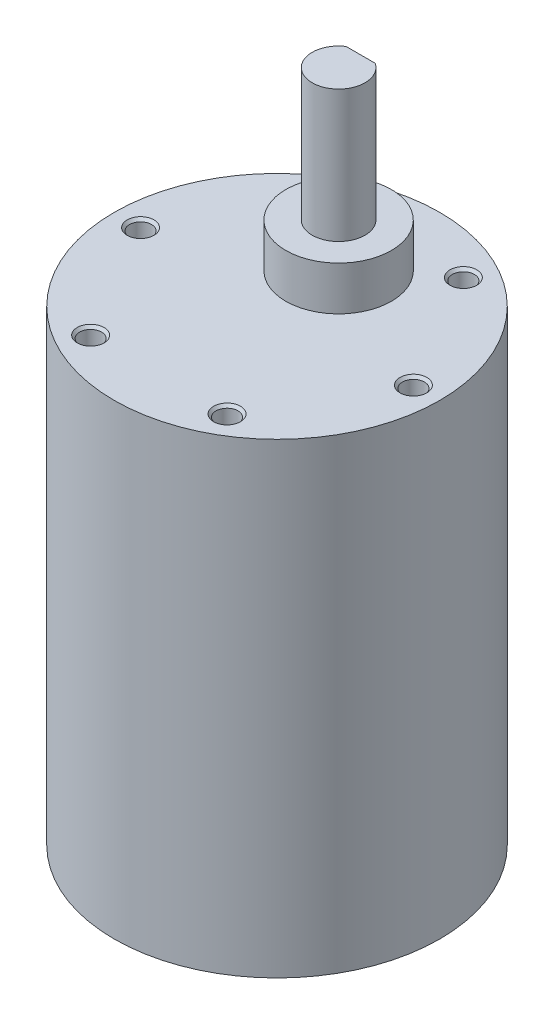
ISO-10303-21;
HEADER;
FILE_DESCRIPTION(('STEP AP214'),'2;1');
FILE_NAME('part.step','',(''),(''),'','','');
FILE_SCHEMA(('AUTOMOTIVE_DESIGN { 1 0 10303 214 1 1 1 1 }'));
ENDSEC;
DATA;
#1=APPLICATION_CONTEXT('core data for automotive mechanical design processes');
#2=APPLICATION_PROTOCOL_DEFINITION('international standard','automotive_design',2000,#1);
#3=PRODUCT_CONTEXT('',#1,'mechanical');
#4=PRODUCT('Part','Part','',(#3));
#5=PRODUCT_RELATED_PRODUCT_CATEGORY('part','',(#4));
#6=PRODUCT_DEFINITION_FORMATION('','',#4);
#7=PRODUCT_DEFINITION_CONTEXT('part definition',#1,'design');
#8=PRODUCT_DEFINITION('design','',#6,#7);
#9=PRODUCT_DEFINITION_SHAPE('','',#8);
#10=(LENGTH_UNIT() NAMED_UNIT(*) SI_UNIT(.MILLI.,.METRE.));
#11=(NAMED_UNIT(*) PLANE_ANGLE_UNIT() SI_UNIT($,.RADIAN.));
#12=(NAMED_UNIT(*) SI_UNIT($,.STERADIAN.) SOLID_ANGLE_UNIT());
#13=UNCERTAINTY_MEASURE_WITH_UNIT(LENGTH_MEASURE(1.E-05),#10,'distance_accuracy_value','');
#14=(GEOMETRIC_REPRESENTATION_CONTEXT(3) GLOBAL_UNCERTAINTY_ASSIGNED_CONTEXT((#13)) GLOBAL_UNIT_ASSIGNED_CONTEXT((#10,
#11,#12)) REPRESENTATION_CONTEXT('',''));
#15=CARTESIAN_POINT('',(0.,0.,0.));
#16=DIRECTION('',(0.,0.,1.));
#17=DIRECTION('',(1.,0.,0.));
#18=AXIS2_PLACEMENT_3D('',#15,#16,#17);
#19=CARTESIAN_POINT('',(0.,53.,0.));
#20=DIRECTION('',(0.,-1.,0.));
#21=DIRECTION('',(0.,0.,-1.));
#22=AXIS2_PLACEMENT_3D('',#19,#20,#21);
#23=CYLINDRICAL_SURFACE('',#22,18.5);
#24=CARTESIAN_POINT('',(0.,53.,0.));
#25=DIRECTION('',(0.,1.,0.));
#26=DIRECTION('',(0.,0.,1.));
#27=AXIS2_PLACEMENT_3D('',#24,#25,#26);
#28=CIRCLE('',#27,18.5);
#29=CARTESIAN_POINT('',(0.,53.,18.5));
#30=VERTEX_POINT('',#29);
#31=EDGE_CURVE('E201',#30,#30,#28,.T.);
#32=ORIENTED_EDGE('',*,*,#31,.F.);
#33=EDGE_LOOP('',(#32));
#34=FACE_BOUND('',#33,.T.);
#35=CARTESIAN_POINT('',(0.,0.,0.));
#36=DIRECTION('',(0.,1.,0.));
#37=DIRECTION('',(0.,0.,1.));
#38=AXIS2_PLACEMENT_3D('',#35,#36,#37);
#39=CIRCLE('',#38,18.5);
#40=CARTESIAN_POINT('',(0.,0.,18.5));
#41=VERTEX_POINT('',#40);
#42=EDGE_CURVE('E196',#41,#41,#39,.T.);
#43=ORIENTED_EDGE('',*,*,#42,.T.);
#44=EDGE_LOOP('',(#43));
#45=FACE_BOUND('',#44,.T.);
#46=ADVANCED_FACE('F54',(#34,#45),#23,.T.);
#47=CARTESIAN_POINT('',(0.,53.,0.));
#48=DIRECTION('',(0.,1.,0.));
#49=DIRECTION('',(0.,0.,1.));
#50=AXIS2_PLACEMENT_3D('',#47,#48,#49);
#51=PLANE('',#50);
#52=CARTESIAN_POINT('',(15.5,53.,-1.62196645003831E-13));
#53=DIRECTION('',(0.,1.,0.));
#54=DIRECTION('',(0.,0.,1.));
#55=AXIS2_PLACEMENT_3D('',#52,#53,#54);
#56=CIRCLE('',#55,1.525);
#57=CARTESIAN_POINT('',(15.5,53.,1.52499999999984));
#58=VERTEX_POINT('',#57);
#59=EDGE_CURVE('E118',#58,#58,#56,.T.);
#60=ORIENTED_EDGE('',*,*,#59,.F.);
#61=EDGE_LOOP('',(#60));
#62=FACE_BOUND('',#61,.T.);
#63=CARTESIAN_POINT('',(7.75000000000011,53.,13.4233937586587));
#64=DIRECTION('',(0.,1.,0.));
#65=DIRECTION('',(0.,0.,1.));
#66=AXIS2_PLACEMENT_3D('',#63,#64,#65);
#67=CIRCLE('',#66,1.525);
#68=CARTESIAN_POINT('',(7.75000000000011,53.,14.9483937586587));
#69=VERTEX_POINT('',#68);
#70=EDGE_CURVE('E109',#69,#69,#67,.T.);
#71=ORIENTED_EDGE('',*,*,#70,.F.);
#72=EDGE_LOOP('',(#71));
#73=FACE_BOUND('',#72,.T.);
#74=CARTESIAN_POINT('',(-7.75000000000002,53.,13.4233937586588));
#75=DIRECTION('',(0.,1.,0.));
#76=DIRECTION('',(0.,0.,1.));
#77=AXIS2_PLACEMENT_3D('',#74,#75,#76);
#78=CIRCLE('',#77,1.525);
#79=CARTESIAN_POINT('',(-7.75000000000002,53.,14.9483937586588));
#80=VERTEX_POINT('',#79);
#81=EDGE_CURVE('E129',#80,#80,#78,.T.);
#82=ORIENTED_EDGE('',*,*,#81,.F.);
#83=EDGE_LOOP('',(#82));
#84=FACE_BOUND('',#83,.T.);
#85=CARTESIAN_POINT('',(-15.5,53.,0.));
#86=DIRECTION('',(0.,1.,0.));
#87=DIRECTION('',(0.,0.,1.));
#88=AXIS2_PLACEMENT_3D('',#85,#86,#87);
#89=CIRCLE('',#88,1.525);
#90=CARTESIAN_POINT('',(-15.5,53.,1.52500000000005));
#91=VERTEX_POINT('',#90);
#92=EDGE_CURVE('E141',#91,#91,#89,.T.);
#93=ORIENTED_EDGE('',*,*,#92,.F.);
#94=EDGE_LOOP('',(#93));
#95=FACE_BOUND('',#94,.T.);
#96=CARTESIAN_POINT('',(-7.75000000000002,53.,-13.4233937586588));
#97=DIRECTION('',(0.,1.,0.));
#98=DIRECTION('',(0.,0.,1.));
#99=AXIS2_PLACEMENT_3D('',#96,#97,#98);
#100=CIRCLE('',#99,1.525);
#101=CARTESIAN_POINT('',(-7.75000000000002,53.,-11.8983937586588));
#102=VERTEX_POINT('',#101);
#103=EDGE_CURVE('E153',#102,#102,#100,.T.);
#104=ORIENTED_EDGE('',*,*,#103,.F.);
#105=EDGE_LOOP('',(#104));
#106=FACE_BOUND('',#105,.T.);
#107=CARTESIAN_POINT('',(7.75000000000002,53.,-13.4233937586588));
#108=DIRECTION('',(0.,1.,0.));
#109=DIRECTION('',(0.,0.,1.));
#110=AXIS2_PLACEMENT_3D('',#107,#108,#109);
#111=CIRCLE('',#110,1.525);
#112=CARTESIAN_POINT('',(7.75000000000002,53.,-11.8983937586588));
#113=VERTEX_POINT('',#112);
#114=EDGE_CURVE('E165',#113,#113,#111,.T.);
#115=ORIENTED_EDGE('',*,*,#114,.F.);
#116=EDGE_LOOP('',(#115));
#117=FACE_BOUND('',#116,.T.);
#118=CARTESIAN_POINT('',(0.,53.,-7.));
#119=DIRECTION('',(0.,1.,0.));
#120=DIRECTION('',(0.,0.,1.));
#121=AXIS2_PLACEMENT_3D('',#118,#119,#120);
#122=CIRCLE('',#121,6.);
#123=CARTESIAN_POINT('',(0.,53.,-0.999999999999999));
#124=VERTEX_POINT('',#123);
#125=EDGE_CURVE('E197',#124,#124,#122,.T.);
#126=ORIENTED_EDGE('',*,*,#125,.F.);
#127=EDGE_LOOP('',(#126));
#128=FACE_BOUND('',#127,.T.);
#129=ORIENTED_EDGE('',*,*,#31,.T.);
#130=EDGE_LOOP('',(#129));
#131=FACE_BOUND('',#130,.T.);
#132=ADVANCED_FACE('F229',(#62,#73,#84,#95,#106,#117,#128,#131),#51,.T.);
#133=CARTESIAN_POINT('',(0.,0.,0.));
#134=DIRECTION('',(0.,1.,0.));
#135=DIRECTION('',(0.,0.,1.));
#136=AXIS2_PLACEMENT_3D('',#133,#134,#135);
#137=PLANE('',#136);
#138=ORIENTED_EDGE('',*,*,#42,.F.);
#139=EDGE_LOOP('',(#138));
#140=FACE_BOUND('',#139,.T.);
#141=ADVANCED_FACE('F234',(#140),#137,.F.);
#142=CARTESIAN_POINT('',(0.,58.,-7.));
#143=DIRECTION('',(0.,-1.,0.));
#144=DIRECTION('',(0.,0.,-1.));
#145=AXIS2_PLACEMENT_3D('',#142,#143,#144);
#146=CYLINDRICAL_SURFACE('',#145,6.);
#147=CARTESIAN_POINT('',(0.,58.,-7.));
#148=DIRECTION('',(0.,1.,0.));
#149=DIRECTION('',(0.,0.,1.));
#150=AXIS2_PLACEMENT_3D('',#147,#148,#149);
#151=CIRCLE('',#150,6.);
#152=CARTESIAN_POINT('',(0.,58.,-0.999999999999999));
#153=VERTEX_POINT('',#152);
#154=EDGE_CURVE('E192',#153,#153,#151,.T.);
#155=ORIENTED_EDGE('',*,*,#154,.F.);
#156=EDGE_LOOP('',(#155));
#157=FACE_BOUND('',#156,.T.);
#158=ORIENTED_EDGE('',*,*,#125,.T.);
#159=EDGE_LOOP('',(#158));
#160=FACE_BOUND('',#159,.T.);
#161=ADVANCED_FACE('F242',(#157,#160),#146,.T.);
#162=CARTESIAN_POINT('',(0.,58.,0.));
#163=DIRECTION('',(0.,1.,0.));
#164=DIRECTION('',(0.,0.,1.));
#165=AXIS2_PLACEMENT_3D('',#162,#163,#164);
#166=PLANE('',#165);
#167=CARTESIAN_POINT('',(0.,58.,-7.));
#168=DIRECTION('',(0.,1.,0.));
#169=DIRECTION('',(0.,0.,1.));
#170=AXIS2_PLACEMENT_3D('',#167,#168,#169);
#171=CIRCLE('',#170,3.);
#172=CARTESIAN_POINT('',(0.,58.,-4.));
#173=VERTEX_POINT('',#172);
#174=EDGE_CURVE('E188',#173,#173,#171,.T.);
#175=ORIENTED_EDGE('',*,*,#174,.F.);
#176=EDGE_LOOP('',(#175));
#177=FACE_BOUND('',#176,.T.);
#178=ORIENTED_EDGE('',*,*,#154,.T.);
#179=EDGE_LOOP('',(#178));
#180=FACE_BOUND('',#179,.T.);
#181=ADVANCED_FACE('F225',(#177,#180),#166,.T.);
#182=CARTESIAN_POINT('',(0.,73.,-7.));
#183=DIRECTION('',(0.,-1.,0.));
#184=DIRECTION('',(0.,0.,-1.));
#185=AXIS2_PLACEMENT_3D('',#182,#183,#184);
#186=CYLINDRICAL_SURFACE('',#185,3.);
#187=CARTESIAN_POINT('',(0.,73.,-7.));
#188=DIRECTION('',(0.,1.,0.));
#189=DIRECTION('',(0.,0.,1.));
#190=AXIS2_PLACEMENT_3D('',#187,#188,#189);
#191=CIRCLE('',#190,3.);
#192=CARTESIAN_POINT('',(-1.6583123951777,73.,-9.5));
#193=VERTEX_POINT('',#192);
#194=CARTESIAN_POINT('',(1.6583123951777,73.,-9.5));
#195=VERTEX_POINT('',#194);
#196=EDGE_CURVE('E184',#193,#195,#191,.T.);
#197=ORIENTED_EDGE('',*,*,#196,.F.);
#198=DIRECTION('',(0.,-1.,0.));
#199=VECTOR('',#198,1.);
#200=CARTESIAN_POINT('',(-1.6583123951777,73.,-9.5));
#201=LINE('',#200,#199);
#202=CARTESIAN_POINT('',(-1.6583123951777,59.,-9.5));
#203=VERTEX_POINT('',#202);
#204=EDGE_CURVE('E69',#193,#203,#201,.T.);
#205=ORIENTED_EDGE('',*,*,#204,.T.);
#206=CARTESIAN_POINT('',(0.,59.,-7.));
#207=DIRECTION('',(0.,1.,0.));
#208=DIRECTION('',(0.,0.,1.));
#209=AXIS2_PLACEMENT_3D('',#206,#207,#208);
#210=CIRCLE('',#209,3.);
#211=CARTESIAN_POINT('',(1.6583123951777,59.,-9.5));
#212=VERTEX_POINT('',#211);
#213=EDGE_CURVE('E11',#212,#203,#210,.T.);
#214=ORIENTED_EDGE('',*,*,#213,.F.);
#215=DIRECTION('',(0.,-1.,0.));
#216=VECTOR('',#215,1.);
#217=CARTESIAN_POINT('',(1.6583123951777,73.,-9.5));
#218=LINE('',#217,#216);
#219=EDGE_CURVE('E74',#212,#195,#218,.F.);
#220=ORIENTED_EDGE('',*,*,#219,.T.);
#221=EDGE_LOOP('',(#197,#205,#214,#220));
#222=FACE_BOUND('',#221,.T.);
#223=ORIENTED_EDGE('',*,*,#174,.T.);
#224=EDGE_LOOP('',(#223));
#225=FACE_BOUND('',#224,.T.);
#226=ADVANCED_FACE('F213',(#222,#225),#186,.T.);
#227=CARTESIAN_POINT('',(0.,73.,0.));
#228=DIRECTION('',(0.,1.,0.));
#229=DIRECTION('',(0.,0.,1.));
#230=AXIS2_PLACEMENT_3D('',#227,#228,#229);
#231=PLANE('',#230);
#232=DIRECTION('',(1.,0.,0.));
#233=VECTOR('',#232,1.);
#234=CARTESIAN_POINT('',(0.,73.,-9.5));
#235=LINE('',#234,#233);
#236=EDGE_CURVE('E62',#193,#195,#235,.T.);
#237=ORIENTED_EDGE('',*,*,#236,.F.);
#238=ORIENTED_EDGE('',*,*,#196,.T.);
#239=EDGE_LOOP('',(#237,#238));
#240=FACE_BOUND('',#239,.T.);
#241=ADVANCED_FACE('F215',(#240),#231,.T.);
#242=CARTESIAN_POINT('',(0.,59.,0.));
#243=DIRECTION('',(0.,1.,0.));
#244=DIRECTION('',(0.,0.,1.));
#245=AXIS2_PLACEMENT_3D('',#242,#243,#244);
#246=PLANE('',#245);
#247=ORIENTED_EDGE('',*,*,#213,.T.);
#248=DIRECTION('',(1.,0.,0.));
#249=VECTOR('',#248,1.);
#250=CARTESIAN_POINT('',(-3.79972873056625,59.,-9.5));
#251=LINE('',#250,#249);
#252=EDGE_CURVE('E177',#203,#212,#251,.T.);
#253=ORIENTED_EDGE('',*,*,#252,.T.);
#254=EDGE_LOOP('',(#247,#253));
#255=FACE_BOUND('',#254,.T.);
#256=ADVANCED_FACE('F217',(#255),#246,.T.);
#257=CARTESIAN_POINT('',(-3.79972873056625,59.,-9.5));
#258=DIRECTION('',(0.,0.,1.));
#259=DIRECTION('',(1.,0.,0.));
#260=AXIS2_PLACEMENT_3D('',#257,#258,#259);
#261=PLANE('',#260);
#262=ORIENTED_EDGE('',*,*,#236,.T.);
#263=ORIENTED_EDGE('',*,*,#219,.F.);
#264=ORIENTED_EDGE('',*,*,#252,.F.);
#265=ORIENTED_EDGE('',*,*,#204,.F.);
#266=EDGE_LOOP('',(#262,#263,#264,#265));
#267=FACE_BOUND('',#266,.T.);
#268=ADVANCED_FACE('F208',(#267),#261,.F.);
#269=CARTESIAN_POINT('',(7.75000000000002,45.,-13.4233937586588));
#270=DIRECTION('',(0.,1.,0.));
#271=DIRECTION('',(0.,0.,1.));
#272=AXIS2_PLACEMENT_3D('',#269,#270,#271);
#273=CONICAL_SURFACE('',#272,1.25,1.02974425867665);
#274=CARTESIAN_POINT('',(7.75000000000001,44.2489242262155,-13.4233937586588));
#275=VERTEX_POINT('',#274);
#276=VERTEX_LOOP('',#275);
#277=FACE_BOUND('',#276,.T.);
#278=CARTESIAN_POINT('',(7.75000000000002,45.,-13.4233937586588));
#279=DIRECTION('',(0.,1.,0.));
#280=DIRECTION('',(0.,0.,1.));
#281=AXIS2_PLACEMENT_3D('',#278,#279,#280);
#282=CIRCLE('',#281,1.25);
#283=CARTESIAN_POINT('',(7.75000000000002,45.,-12.1733937586588));
#284=VERTEX_POINT('',#283);
#285=EDGE_CURVE('E173',#284,#284,#282,.T.);
#286=ORIENTED_EDGE('',*,*,#285,.T.);
#287=EDGE_LOOP('',(#286));
#288=FACE_BOUND('',#287,.T.);
#289=ADVANCED_FACE('F285',(#277,#288),#273,.F.);
#290=CARTESIAN_POINT('',(7.75000000000002,53.,-13.4233937586588));
#291=DIRECTION('',(0.,1.,0.));
#292=DIRECTION('',(0.,0.,1.));
#293=AXIS2_PLACEMENT_3D('',#290,#291,#292);
#294=CYLINDRICAL_SURFACE('',#293,1.25);
#295=ORIENTED_EDGE('',*,*,#285,.F.);
#296=EDGE_LOOP('',(#295));
#297=FACE_BOUND('',#296,.T.);
#298=CARTESIAN_POINT('',(7.75000000000002,52.6836486880142,-13.4233937586588));
#299=DIRECTION('',(0.,1.,0.));
#300=DIRECTION('',(0.,0.,1.));
#301=AXIS2_PLACEMENT_3D('',#298,#299,#300);
#302=CIRCLE('',#301,1.24999999999999);
#303=CARTESIAN_POINT('',(7.75000000000002,52.6836486880142,-12.1733937586588));
#304=VERTEX_POINT('',#303);
#305=EDGE_CURVE('E169',#304,#304,#302,.T.);
#306=ORIENTED_EDGE('',*,*,#305,.T.);
#307=EDGE_LOOP('',(#306));
#308=FACE_BOUND('',#307,.T.);
#309=ADVANCED_FACE('F293',(#297,#308),#294,.F.);
#310=CARTESIAN_POINT('',(7.75000000000002,53.,-13.4233937586588));
#311=DIRECTION('',(0.,1.,0.));
#312=DIRECTION('',(0.,0.,1.));
#313=AXIS2_PLACEMENT_3D('',#310,#311,#312);
#314=CONICAL_SURFACE('',#313,1.525,0.71558499331768);
#315=ORIENTED_EDGE('',*,*,#305,.F.);
#316=EDGE_LOOP('',(#315));
#317=FACE_BOUND('',#316,.T.);
#318=ORIENTED_EDGE('',*,*,#114,.T.);
#319=EDGE_LOOP('',(#318));
#320=FACE_BOUND('',#319,.T.);
#321=ADVANCED_FACE('F304',(#317,#320),#314,.F.);
#322=CARTESIAN_POINT('',(-7.75000000000002,45.,-13.4233937586588));
#323=DIRECTION('',(0.,1.,0.));
#324=DIRECTION('',(0.,0.,1.));
#325=AXIS2_PLACEMENT_3D('',#322,#323,#324);
#326=CONICAL_SURFACE('',#325,1.25,1.02974425867665);
#327=CARTESIAN_POINT('',(-7.75000000000002,44.2489242262155,-13.4233937586588));
#328=VERTEX_POINT('',#327);
#329=VERTEX_LOOP('',#328);
#330=FACE_BOUND('',#329,.T.);
#331=CARTESIAN_POINT('',(-7.75000000000002,45.,-13.4233937586588));
#332=DIRECTION('',(0.,1.,0.));
#333=DIRECTION('',(0.,0.,1.));
#334=AXIS2_PLACEMENT_3D('',#331,#332,#333);
#335=CIRCLE('',#334,1.25);
#336=CARTESIAN_POINT('',(-7.75000000000002,45.,-12.1733937586588));
#337=VERTEX_POINT('',#336);
#338=EDGE_CURVE('E161',#337,#337,#335,.T.);
#339=ORIENTED_EDGE('',*,*,#338,.T.);
#340=EDGE_LOOP('',(#339));
#341=FACE_BOUND('',#340,.T.);
#342=ADVANCED_FACE('F315',(#330,#341),#326,.F.);
#343=CARTESIAN_POINT('',(-7.75000000000002,53.,-13.4233937586588));
#344=DIRECTION('',(0.,1.,0.));
#345=DIRECTION('',(0.,0.,1.));
#346=AXIS2_PLACEMENT_3D('',#343,#344,#345);
#347=CYLINDRICAL_SURFACE('',#346,1.25);
#348=ORIENTED_EDGE('',*,*,#338,.F.);
#349=EDGE_LOOP('',(#348));
#350=FACE_BOUND('',#349,.T.);
#351=CARTESIAN_POINT('',(-7.75000000000002,52.6836486880142,-13.4233937586588));
#352=DIRECTION('',(0.,1.,0.));
#353=DIRECTION('',(0.,0.,1.));
#354=AXIS2_PLACEMENT_3D('',#351,#352,#353);
#355=CIRCLE('',#354,1.24999999999999);
#356=CARTESIAN_POINT('',(-7.75000000000002,52.6836486880142,-12.1733937586588));
#357=VERTEX_POINT('',#356);
#358=EDGE_CURVE('E157',#357,#357,#355,.T.);
#359=ORIENTED_EDGE('',*,*,#358,.T.);
#360=EDGE_LOOP('',(#359));
#361=FACE_BOUND('',#360,.T.);
#362=ADVANCED_FACE('F343',(#350,#361),#347,.F.);
#363=CARTESIAN_POINT('',(-7.75000000000002,53.,-13.4233937586588));
#364=DIRECTION('',(0.,1.,0.));
#365=DIRECTION('',(0.,0.,1.));
#366=AXIS2_PLACEMENT_3D('',#363,#364,#365);
#367=CONICAL_SURFACE('',#366,1.525,0.715584993317678);
#368=ORIENTED_EDGE('',*,*,#358,.F.);
#369=EDGE_LOOP('',(#368));
#370=FACE_BOUND('',#369,.T.);
#371=ORIENTED_EDGE('',*,*,#103,.T.);
#372=EDGE_LOOP('',(#371));
#373=FACE_BOUND('',#372,.T.);
#374=ADVANCED_FACE('F353',(#370,#373),#367,.F.);
#375=CARTESIAN_POINT('',(-15.5,45.,0.));
#376=DIRECTION('',(0.,1.,0.));
#377=DIRECTION('',(0.,0.,1.));
#378=AXIS2_PLACEMENT_3D('',#375,#376,#377);
#379=CONICAL_SURFACE('',#378,1.25,1.02974425867665);
#380=CARTESIAN_POINT('',(-15.5,44.2489242262155,0.));
#381=VERTEX_POINT('',#380);
#382=VERTEX_LOOP('',#381);
#383=FACE_BOUND('',#382,.T.);
#384=CARTESIAN_POINT('',(-15.5,45.,0.));
#385=DIRECTION('',(0.,1.,0.));
#386=DIRECTION('',(0.,0.,1.));
#387=AXIS2_PLACEMENT_3D('',#384,#385,#386);
#388=CIRCLE('',#387,1.25);
#389=CARTESIAN_POINT('',(-15.5,45.,1.25000000000005));
#390=VERTEX_POINT('',#389);
#391=EDGE_CURVE('E149',#390,#390,#388,.T.);
#392=ORIENTED_EDGE('',*,*,#391,.T.);
#393=EDGE_LOOP('',(#392));
#394=FACE_BOUND('',#393,.T.);
#395=ADVANCED_FACE('F365',(#383,#394),#379,.F.);
#396=CARTESIAN_POINT('',(-15.5,53.,0.));
#397=DIRECTION('',(0.,1.,0.));
#398=DIRECTION('',(0.,0.,1.));
#399=AXIS2_PLACEMENT_3D('',#396,#397,#398);
#400=CYLINDRICAL_SURFACE('',#399,1.25);
#401=ORIENTED_EDGE('',*,*,#391,.F.);
#402=EDGE_LOOP('',(#401));
#403=FACE_BOUND('',#402,.T.);
#404=CARTESIAN_POINT('',(-15.5,52.6836486880142,0.));
#405=DIRECTION('',(0.,1.,0.));
#406=DIRECTION('',(0.,0.,1.));
#407=AXIS2_PLACEMENT_3D('',#404,#405,#406);
#408=CIRCLE('',#407,1.24999999999999);
#409=CARTESIAN_POINT('',(-15.5,52.6836486880142,1.25000000000005));
#410=VERTEX_POINT('',#409);
#411=EDGE_CURVE('E145',#410,#410,#408,.T.);
#412=ORIENTED_EDGE('',*,*,#411,.T.);
#413=EDGE_LOOP('',(#412));
#414=FACE_BOUND('',#413,.T.);
#415=ADVANCED_FACE('F376',(#403,#414),#400,.F.);
#416=CARTESIAN_POINT('',(-15.5,53.,0.));
#417=DIRECTION('',(0.,1.,0.));
#418=DIRECTION('',(0.,0.,1.));
#419=AXIS2_PLACEMENT_3D('',#416,#417,#418);
#420=CONICAL_SURFACE('',#419,1.525,0.71558499331768);
#421=ORIENTED_EDGE('',*,*,#411,.F.);
#422=EDGE_LOOP('',(#421));
#423=FACE_BOUND('',#422,.T.);
#424=ORIENTED_EDGE('',*,*,#92,.T.);
#425=EDGE_LOOP('',(#424));
#426=FACE_BOUND('',#425,.T.);
#427=ADVANCED_FACE('F387',(#423,#426),#420,.F.);
#428=CARTESIAN_POINT('',(-7.75000000000002,45.,13.4233937586588));
#429=DIRECTION('',(0.,1.,0.));
#430=DIRECTION('',(0.,0.,1.));
#431=AXIS2_PLACEMENT_3D('',#428,#429,#430);
#432=CONICAL_SURFACE('',#431,1.25,1.02974425867665);
#433=CARTESIAN_POINT('',(-7.75000000000002,44.2489242262155,13.4233937586588));
#434=VERTEX_POINT('',#433);
#435=VERTEX_LOOP('',#434);
#436=FACE_BOUND('',#435,.T.);
#437=CARTESIAN_POINT('',(-7.75000000000002,45.,13.4233937586588));
#438=DIRECTION('',(0.,1.,0.));
#439=DIRECTION('',(0.,0.,1.));
#440=AXIS2_PLACEMENT_3D('',#437,#438,#439);
#441=CIRCLE('',#440,1.25);
#442=CARTESIAN_POINT('',(-7.75000000000002,45.,14.6733937586588));
#443=VERTEX_POINT('',#442);
#444=EDGE_CURVE('E137',#443,#443,#441,.T.);
#445=ORIENTED_EDGE('',*,*,#444,.T.);
#446=EDGE_LOOP('',(#445));
#447=FACE_BOUND('',#446,.T.);
#448=ADVANCED_FACE('F399',(#436,#447),#432,.F.);
#449=CARTESIAN_POINT('',(-7.75000000000002,53.,13.4233937586588));
#450=DIRECTION('',(0.,1.,0.));
#451=DIRECTION('',(0.,0.,1.));
#452=AXIS2_PLACEMENT_3D('',#449,#450,#451);
#453=CYLINDRICAL_SURFACE('',#452,1.25);
#454=ORIENTED_EDGE('',*,*,#444,.F.);
#455=EDGE_LOOP('',(#454));
#456=FACE_BOUND('',#455,.T.);
#457=CARTESIAN_POINT('',(-7.75000000000002,52.6836486880142,13.4233937586588));
#458=DIRECTION('',(0.,1.,0.));
#459=DIRECTION('',(0.,0.,1.));
#460=AXIS2_PLACEMENT_3D('',#457,#458,#459);
#461=CIRCLE('',#460,1.24999999999999);
#462=CARTESIAN_POINT('',(-7.75000000000002,52.6836486880142,14.6733937586588));
#463=VERTEX_POINT('',#462);
#464=EDGE_CURVE('E133',#463,#463,#461,.T.);
#465=ORIENTED_EDGE('',*,*,#464,.T.);
#466=EDGE_LOOP('',(#465));
#467=FACE_BOUND('',#466,.T.);
#468=ADVANCED_FACE('F410',(#456,#467),#453,.F.);
#469=CARTESIAN_POINT('',(-7.75000000000002,53.,13.4233937586588));
#470=DIRECTION('',(0.,1.,0.));
#471=DIRECTION('',(0.,0.,1.));
#472=AXIS2_PLACEMENT_3D('',#469,#470,#471);
#473=CONICAL_SURFACE('',#472,1.525,0.715584993317678);
#474=ORIENTED_EDGE('',*,*,#464,.F.);
#475=EDGE_LOOP('',(#474));
#476=FACE_BOUND('',#475,.T.);
#477=ORIENTED_EDGE('',*,*,#81,.T.);
#478=EDGE_LOOP('',(#477));
#479=FACE_BOUND('',#478,.T.);
#480=ADVANCED_FACE('F420',(#476,#479),#473,.F.);
#481=CARTESIAN_POINT('',(7.75000000000011,45.,13.4233937586587));
#482=DIRECTION('',(0.,1.,0.));
#483=DIRECTION('',(0.,0.,1.));
#484=AXIS2_PLACEMENT_3D('',#481,#482,#483);
#485=CONICAL_SURFACE('',#484,1.25,1.02974425867665);
#486=CARTESIAN_POINT('',(7.75000000000011,44.2489242262155,13.4233937586587));
#487=VERTEX_POINT('',#486);
#488=VERTEX_LOOP('',#487);
#489=FACE_BOUND('',#488,.T.);
#490=CARTESIAN_POINT('',(7.75000000000011,45.,13.4233937586587));
#491=DIRECTION('',(0.,1.,0.));
#492=DIRECTION('',(0.,0.,1.));
#493=AXIS2_PLACEMENT_3D('',#490,#491,#492);
#494=CIRCLE('',#493,1.25);
#495=CARTESIAN_POINT('',(7.75000000000011,45.,14.6733937586587));
#496=VERTEX_POINT('',#495);
#497=EDGE_CURVE('E125',#496,#496,#494,.T.);
#498=ORIENTED_EDGE('',*,*,#497,.T.);
#499=EDGE_LOOP('',(#498));
#500=FACE_BOUND('',#499,.T.);
#501=ADVANCED_FACE('F431',(#489,#500),#485,.F.);
#502=CARTESIAN_POINT('',(7.75000000000011,53.,13.4233937586587));
#503=DIRECTION('',(0.,1.,0.));
#504=DIRECTION('',(0.,0.,1.));
#505=AXIS2_PLACEMENT_3D('',#502,#503,#504);
#506=CYLINDRICAL_SURFACE('',#505,1.25);
#507=ORIENTED_EDGE('',*,*,#497,.F.);
#508=EDGE_LOOP('',(#507));
#509=FACE_BOUND('',#508,.T.);
#510=CARTESIAN_POINT('',(7.75000000000011,52.6836486880142,13.4233937586587));
#511=DIRECTION('',(0.,1.,0.));
#512=DIRECTION('',(0.,0.,1.));
#513=AXIS2_PLACEMENT_3D('',#510,#511,#512);
#514=CIRCLE('',#513,1.24999999999999);
#515=CARTESIAN_POINT('',(7.75000000000011,52.6836486880142,14.6733937586587));
#516=VERTEX_POINT('',#515);
#517=EDGE_CURVE('E115',#516,#516,#514,.T.);
#518=ORIENTED_EDGE('',*,*,#517,.T.);
#519=EDGE_LOOP('',(#518));
#520=FACE_BOUND('',#519,.T.);
#521=ADVANCED_FACE('F442',(#509,#520),#506,.F.);
#522=CARTESIAN_POINT('',(7.75000000000011,53.,13.4233937586587));
#523=DIRECTION('',(0.,1.,0.));
#524=DIRECTION('',(0.,0.,1.));
#525=AXIS2_PLACEMENT_3D('',#522,#523,#524);
#526=CONICAL_SURFACE('',#525,1.525,0.71558499331768);
#527=ORIENTED_EDGE('',*,*,#517,.F.);
#528=EDGE_LOOP('',(#527));
#529=FACE_BOUND('',#528,.T.);
#530=ORIENTED_EDGE('',*,*,#70,.T.);
#531=EDGE_LOOP('',(#530));
#532=FACE_BOUND('',#531,.T.);
#533=ADVANCED_FACE('F102',(#529,#532),#526,.F.);
#534=CARTESIAN_POINT('',(15.5,45.,-1.62196645003831E-13));
#535=DIRECTION('',(0.,1.,0.));
#536=DIRECTION('',(0.,0.,1.));
#537=AXIS2_PLACEMENT_3D('',#534,#535,#536);
#538=CONICAL_SURFACE('',#537,1.25,1.02974425867665);
#539=CARTESIAN_POINT('',(15.5,44.2489242262155,-1.62196645003831E-13));
#540=VERTEX_POINT('',#539);
#541=VERTEX_LOOP('',#540);
#542=FACE_BOUND('',#541,.T.);
#543=CARTESIAN_POINT('',(15.5,45.,-1.62196645003831E-13));
#544=DIRECTION('',(0.,1.,0.));
#545=DIRECTION('',(0.,0.,1.));
#546=AXIS2_PLACEMENT_3D('',#543,#544,#545);
#547=CIRCLE('',#546,1.25);
#548=CARTESIAN_POINT('',(15.5,45.,1.24999999999984));
#549=VERTEX_POINT('',#548);
#550=EDGE_CURVE('E106',#549,#549,#547,.T.);
#551=ORIENTED_EDGE('',*,*,#550,.T.);
#552=EDGE_LOOP('',(#551));
#553=FACE_BOUND('',#552,.T.);
#554=ADVANCED_FACE('F98',(#542,#553),#538,.F.);
#555=CARTESIAN_POINT('',(15.5,53.,-1.62196645003831E-13));
#556=DIRECTION('',(0.,1.,0.));
#557=DIRECTION('',(0.,0.,1.));
#558=AXIS2_PLACEMENT_3D('',#555,#556,#557);
#559=CYLINDRICAL_SURFACE('',#558,1.25);
#560=ORIENTED_EDGE('',*,*,#550,.F.);
#561=EDGE_LOOP('',(#560));
#562=FACE_BOUND('',#561,.T.);
#563=CARTESIAN_POINT('',(15.5,52.6836486880142,-1.62196645003831E-13));
#564=DIRECTION('',(0.,1.,0.));
#565=DIRECTION('',(0.,0.,1.));
#566=AXIS2_PLACEMENT_3D('',#563,#564,#565);
#567=CIRCLE('',#566,1.24999999999999);
#568=CARTESIAN_POINT('',(15.5,52.6836486880142,1.24999999999983));
#569=VERTEX_POINT('',#568);
#570=EDGE_CURVE('E110',#569,#569,#567,.T.);
#571=ORIENTED_EDGE('',*,*,#570,.T.);
#572=EDGE_LOOP('',(#571));
#573=FACE_BOUND('',#572,.T.);
#574=ADVANCED_FACE('F101',(#562,#573),#559,.F.);
#575=CARTESIAN_POINT('',(15.5,53.,-1.62196645003831E-13));
#576=DIRECTION('',(0.,1.,0.));
#577=DIRECTION('',(0.,0.,1.));
#578=AXIS2_PLACEMENT_3D('',#575,#576,#577);
#579=CONICAL_SURFACE('',#578,1.525,0.715584993317673);
#580=ORIENTED_EDGE('',*,*,#570,.F.);
#581=EDGE_LOOP('',(#580));
#582=FACE_BOUND('',#581,.T.);
#583=ORIENTED_EDGE('',*,*,#59,.T.);
#584=EDGE_LOOP('',(#583));
#585=FACE_BOUND('',#584,.T.);
#586=ADVANCED_FACE('F480',(#582,#585),#579,.F.);
#587=CLOSED_SHELL('',(#46,#132,#141,#161,#181,#226,#241,#256,#268,#289,#309,#321,#342,#362,#374,
#395,#415,#427,#448,#468,#480,#501,#521,#533,#554,#574,#586));
#588=MANIFOLD_SOLID_BREP('B2',#587);
#589=ADVANCED_BREP_SHAPE_REPRESENTATION('',(#18,#588),#14);
#590=SHAPE_DEFINITION_REPRESENTATION(#9,#589);
ENDSEC;
END-ISO-10303-21;
